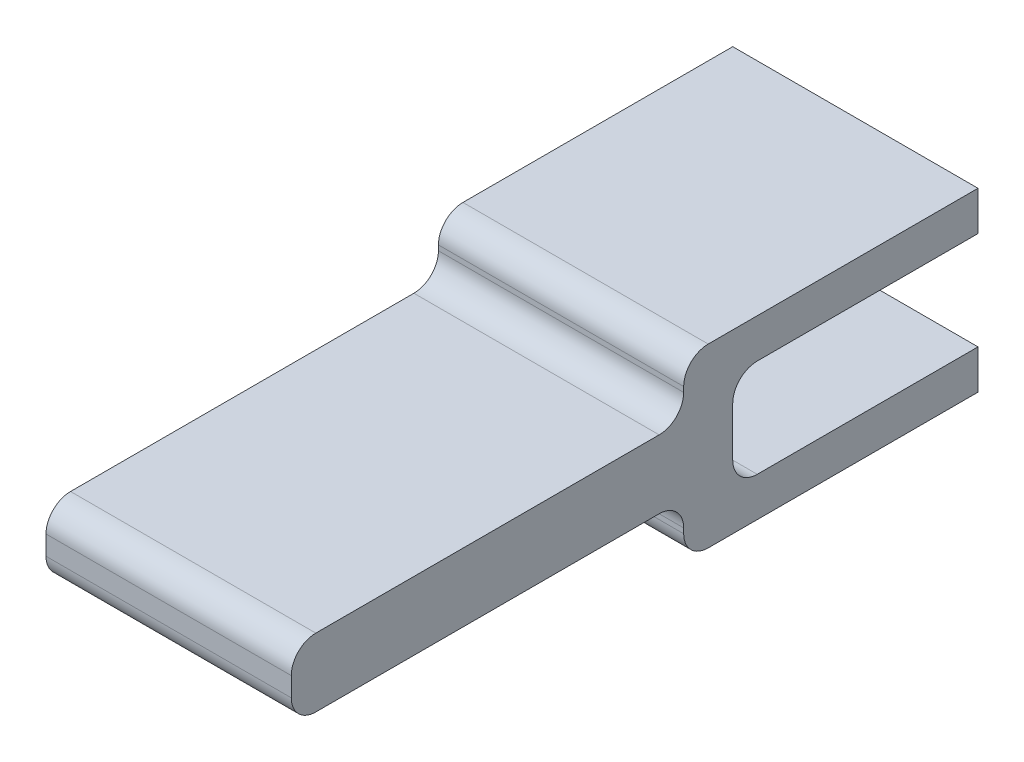
ISO-10303-21;
HEADER;
FILE_DESCRIPTION(('STEP AP214'),'2;1');
FILE_NAME('part.step','',(''),(''),'','','');
FILE_SCHEMA(('AUTOMOTIVE_DESIGN { 1 0 10303 214 1 1 1 1 }'));
ENDSEC;
DATA;
#1=APPLICATION_CONTEXT('core data for automotive mechanical design processes');
#2=APPLICATION_PROTOCOL_DEFINITION('international standard','automotive_design',2000,#1);
#3=PRODUCT_CONTEXT('',#1,'mechanical');
#4=PRODUCT('Part','Part','',(#3));
#5=PRODUCT_RELATED_PRODUCT_CATEGORY('part','',(#4));
#6=PRODUCT_DEFINITION_FORMATION('','',#4);
#7=PRODUCT_DEFINITION_CONTEXT('part definition',#1,'design');
#8=PRODUCT_DEFINITION('design','',#6,#7);
#9=PRODUCT_DEFINITION_SHAPE('','',#8);
#10=(LENGTH_UNIT() NAMED_UNIT(*) SI_UNIT(.MILLI.,.METRE.));
#11=(NAMED_UNIT(*) PLANE_ANGLE_UNIT() SI_UNIT($,.RADIAN.));
#12=(NAMED_UNIT(*) SI_UNIT($,.STERADIAN.) SOLID_ANGLE_UNIT());
#13=UNCERTAINTY_MEASURE_WITH_UNIT(LENGTH_MEASURE(1.E-05),#10,'distance_accuracy_value','');
#14=(GEOMETRIC_REPRESENTATION_CONTEXT(3) GLOBAL_UNCERTAINTY_ASSIGNED_CONTEXT((#13)) GLOBAL_UNIT_ASSIGNED_CONTEXT((#10,
#11,#12)) REPRESENTATION_CONTEXT('',''));
#15=CARTESIAN_POINT('',(0.,0.,0.));
#16=DIRECTION('',(0.,0.,1.));
#17=DIRECTION('',(1.,0.,0.));
#18=AXIS2_PLACEMENT_3D('',#15,#16,#17);
#19=CARTESIAN_POINT('',(0.,0.,6.));
#20=DIRECTION('',(0.,0.,1.));
#21=DIRECTION('',(1.,0.,0.));
#22=AXIS2_PLACEMENT_3D('',#19,#20,#21);
#23=PLANE('',#22);
#24=DIRECTION('',(0.,-1.,0.));
#25=VECTOR('',#24,1.);
#26=CARTESIAN_POINT('',(-2.5,1.8,6.));
#27=LINE('',#26,#25);
#28=CARTESIAN_POINT('',(-2.5,-1.1965181035401,6.));
#29=VERTEX_POINT('',#28);
#30=CARTESIAN_POINT('',(-2.5,-1.3,6.));
#31=VERTEX_POINT('',#30);
#32=EDGE_CURVE('E235',#29,#31,#27,.T.);
#33=ORIENTED_EDGE('',*,*,#32,.T.);
#34=DIRECTION('',(1.,0.,0.));
#35=VECTOR('',#34,1.);
#36=CARTESIAN_POINT('',(2.5,-1.3,6.));
#37=LINE('',#36,#35);
#38=CARTESIAN_POINT('',(2.5,-1.3,6.));
#39=VERTEX_POINT('',#38);
#40=EDGE_CURVE('E295',#31,#39,#37,.T.);
#41=ORIENTED_EDGE('',*,*,#40,.T.);
#42=DIRECTION('',(0.,1.,0.));
#43=VECTOR('',#42,1.);
#44=CARTESIAN_POINT('',(2.5,1.8,6.));
#45=LINE('',#44,#43);
#46=CARTESIAN_POINT('',(2.5,-1.1965181035401,6.));
#47=VERTEX_POINT('',#46);
#48=EDGE_CURVE('E236',#39,#47,#45,.T.);
#49=ORIENTED_EDGE('',*,*,#48,.T.);
#50=DIRECTION('',(1.,0.,0.));
#51=VECTOR('',#50,1.);
#52=CARTESIAN_POINT('',(0.,-1.1965181035401,6.));
#53=LINE('',#52,#51);
#54=EDGE_CURVE('E293',#47,#29,#53,.F.);
#55=ORIENTED_EDGE('',*,*,#54,.T.);
#56=EDGE_LOOP('',(#33,#41,#49,#55));
#57=FACE_BOUND('',#56,.T.);
#58=ADVANCED_FACE('F57',(#57),#23,.T.);
#59=CARTESIAN_POINT('',(0.,0.,0.));
#60=DIRECTION('',(0.,0.,1.));
#61=DIRECTION('',(1.,0.,0.));
#62=AXIS2_PLACEMENT_3D('',#59,#60,#61);
#63=PLANE('',#62);
#64=DIRECTION('',(-1.,0.,0.));
#65=VECTOR('',#64,1.);
#66=CARTESIAN_POINT('',(-2.5,1.,0.));
#67=LINE('',#66,#65);
#68=CARTESIAN_POINT('',(2.5,1.,0.));
#69=VERTEX_POINT('',#68);
#70=CARTESIAN_POINT('',(-2.5,1.,0.));
#71=VERTEX_POINT('',#70);
#72=EDGE_CURVE('E204',#69,#71,#67,.T.);
#73=ORIENTED_EDGE('',*,*,#72,.T.);
#74=DIRECTION('',(0.,-1.,0.));
#75=VECTOR('',#74,1.);
#76=CARTESIAN_POINT('',(-2.5,1.8,0.));
#77=LINE('',#76,#75);
#78=CARTESIAN_POINT('',(-2.5,1.8,0.));
#79=VERTEX_POINT('',#78);
#80=EDGE_CURVE('E255',#79,#71,#77,.T.);
#81=ORIENTED_EDGE('',*,*,#80,.F.);
#82=DIRECTION('',(-1.,0.,0.));
#83=VECTOR('',#82,1.);
#84=CARTESIAN_POINT('',(-2.5,1.8,0.));
#85=LINE('',#84,#83);
#86=CARTESIAN_POINT('',(2.5,1.8,0.));
#87=VERTEX_POINT('',#86);
#88=EDGE_CURVE('E241',#87,#79,#85,.T.);
#89=ORIENTED_EDGE('',*,*,#88,.F.);
#90=DIRECTION('',(0.,1.,0.));
#91=VECTOR('',#90,1.);
#92=CARTESIAN_POINT('',(2.5,1.8,0.));
#93=LINE('',#92,#91);
#94=EDGE_CURVE('E247',#69,#87,#93,.T.);
#95=ORIENTED_EDGE('',*,*,#94,.F.);
#96=EDGE_LOOP('',(#73,#81,#89,#95));
#97=FACE_BOUND('',#96,.T.);
#98=ADVANCED_FACE('F402',(#97),#63,.F.);
#99=CARTESIAN_POINT('',(-2.5,1.8,5.));
#100=DIRECTION('',(0.,-1.,0.));
#101=DIRECTION('',(0.,0.,-1.));
#102=AXIS2_PLACEMENT_3D('',#99,#100,#101);
#103=PLANE('',#102);
#104=DIRECTION('',(0.,0.,1.));
#105=VECTOR('',#104,1.);
#106=CARTESIAN_POINT('',(-2.5,1.8,-0.00100000000000013));
#107=LINE('',#106,#105);
#108=CARTESIAN_POINT('',(-2.5,1.8,5.5));
#109=VERTEX_POINT('',#108);
#110=EDGE_CURVE('E244',#79,#109,#107,.T.);
#111=ORIENTED_EDGE('',*,*,#110,.T.);
#112=DIRECTION('',(-1.,0.,0.));
#113=VECTOR('',#112,1.);
#114=CARTESIAN_POINT('',(2.5,1.8,5.5));
#115=LINE('',#114,#113);
#116=CARTESIAN_POINT('',(2.5,1.8,5.5));
#117=VERTEX_POINT('',#116);
#118=EDGE_CURVE('E304',#109,#117,#115,.F.);
#119=ORIENTED_EDGE('',*,*,#118,.T.);
#120=DIRECTION('',(0.,0.,1.));
#121=VECTOR('',#120,1.);
#122=CARTESIAN_POINT('',(2.5,1.8,-0.00100000000000013));
#123=LINE('',#122,#121);
#124=EDGE_CURVE('E252',#87,#117,#123,.T.);
#125=ORIENTED_EDGE('',*,*,#124,.F.);
#126=ORIENTED_EDGE('',*,*,#88,.T.);
#127=EDGE_LOOP('',(#111,#119,#125,#126));
#128=FACE_BOUND('',#127,.T.);
#129=ADVANCED_FACE('F407',(#128),#103,.F.);
#130=CARTESIAN_POINT('',(-2.5,1.,5.));
#131=DIRECTION('',(0.,-1.,0.));
#132=DIRECTION('',(0.,0.,-1.));
#133=AXIS2_PLACEMENT_3D('',#130,#131,#132);
#134=PLANE('',#133);
#135=DIRECTION('',(0.,0.,-1.));
#136=VECTOR('',#135,1.);
#137=CARTESIAN_POINT('',(2.5,1.,5.));
#138=LINE('',#137,#136);
#139=CARTESIAN_POINT('',(2.5,1.,4.5));
#140=VERTEX_POINT('',#139);
#141=EDGE_CURVE('E245',#140,#69,#138,.T.);
#142=ORIENTED_EDGE('',*,*,#141,.F.);
#143=DIRECTION('',(-1.,0.,0.));
#144=VECTOR('',#143,1.);
#145=CARTESIAN_POINT('',(-2.5,1.,4.5));
#146=LINE('',#145,#144);
#147=CARTESIAN_POINT('',(-2.5,1.,4.5));
#148=VERTEX_POINT('',#147);
#149=EDGE_CURVE('E306',#140,#148,#146,.T.);
#150=ORIENTED_EDGE('',*,*,#149,.T.);
#151=DIRECTION('',(0.,0.,-1.));
#152=VECTOR('',#151,1.);
#153=CARTESIAN_POINT('',(-2.5,1.,5.));
#154=LINE('',#153,#152);
#155=EDGE_CURVE('E248',#148,#71,#154,.T.);
#156=ORIENTED_EDGE('',*,*,#155,.T.);
#157=ORIENTED_EDGE('',*,*,#72,.F.);
#158=EDGE_LOOP('',(#142,#150,#156,#157));
#159=FACE_BOUND('',#158,.T.);
#160=ADVANCED_FACE('F426',(#159),#134,.T.);
#161=CARTESIAN_POINT('',(2.5,1.8,-0.00100000000000013));
#162=DIRECTION('',(-1.,0.,0.));
#163=DIRECTION('',(0.,0.,1.));
#164=AXIS2_PLACEMENT_3D('',#161,#162,#163);
#165=PLANE('',#164);
#166=DIRECTION('',(0.,0.,-1.));
#167=VECTOR('',#166,1.);
#168=CARTESIAN_POINT('',(2.5,0.6965181035401,14.));
#169=LINE('',#168,#167);
#170=CARTESIAN_POINT('',(2.5,0.6965181035401,13.5));
#171=VERTEX_POINT('',#170);
#172=CARTESIAN_POINT('',(2.5,0.6965181035401,6.5));
#173=VERTEX_POINT('',#172);
#174=EDGE_CURVE('E341',#171,#173,#169,.T.);
#175=ORIENTED_EDGE('',*,*,#174,.F.);
#176=CARTESIAN_POINT('',(2.5,0.1965181035401,13.5));
#177=DIRECTION('',(-1.,0.,0.));
#178=DIRECTION('',(0.,0.,1.));
#179=AXIS2_PLACEMENT_3D('',#176,#177,#178);
#180=CIRCLE('',#179,0.5);
#181=CARTESIAN_POINT('',(2.5,0.1965181035401,14.));
#182=VERTEX_POINT('',#181);
#183=EDGE_CURVE('E286',#171,#182,#180,.F.);
#184=ORIENTED_EDGE('',*,*,#183,.T.);
#185=DIRECTION('',(0.,1.,0.));
#186=VECTOR('',#185,1.);
#187=CARTESIAN_POINT('',(2.5,0.6965181035401,14.));
#188=LINE('',#187,#186);
#189=CARTESIAN_POINT('',(2.5,-0.1965181035401,14.));
#190=VERTEX_POINT('',#189);
#191=EDGE_CURVE('E381',#190,#182,#188,.T.);
#192=ORIENTED_EDGE('',*,*,#191,.F.);
#193=CARTESIAN_POINT('',(2.5,-0.1965181035401,13.5));
#194=DIRECTION('',(-1.,0.,0.));
#195=DIRECTION('',(0.,0.,1.));
#196=AXIS2_PLACEMENT_3D('',#193,#194,#195);
#197=CIRCLE('',#196,0.5);
#198=CARTESIAN_POINT('',(2.5,-0.6965181035401,13.5));
#199=VERTEX_POINT('',#198);
#200=EDGE_CURVE('E284',#190,#199,#197,.F.);
#201=ORIENTED_EDGE('',*,*,#200,.T.);
#202=DIRECTION('',(0.,0.,-1.));
#203=VECTOR('',#202,1.);
#204=CARTESIAN_POINT('',(2.5,-0.6965181035401,14.));
#205=LINE('',#204,#203);
#206=CARTESIAN_POINT('',(2.5,-0.6965181035401,6.5));
#207=VERTEX_POINT('',#206);
#208=EDGE_CURVE('E375',#199,#207,#205,.T.);
#209=ORIENTED_EDGE('',*,*,#208,.T.);
#210=CARTESIAN_POINT('',(2.5,-1.1965181035401,6.5));
#211=DIRECTION('',(-1.,0.,0.));
#212=DIRECTION('',(0.,0.,1.));
#213=AXIS2_PLACEMENT_3D('',#210,#211,#212);
#214=CIRCLE('',#213,0.5);
#215=EDGE_CURVE('E322',#207,#47,#214,.T.);
#216=ORIENTED_EDGE('',*,*,#215,.T.);
#217=ORIENTED_EDGE('',*,*,#48,.F.);
#218=CARTESIAN_POINT('',(2.5,-1.3,5.5));
#219=DIRECTION('',(-1.,0.,0.));
#220=DIRECTION('',(0.,0.,1.));
#221=AXIS2_PLACEMENT_3D('',#218,#219,#220);
#222=CIRCLE('',#221,0.5);
#223=CARTESIAN_POINT('',(2.5,-1.8,5.5));
#224=VERTEX_POINT('',#223);
#225=EDGE_CURVE('E282',#39,#224,#222,.F.);
#226=ORIENTED_EDGE('',*,*,#225,.T.);
#227=DIRECTION('',(0.,0.,-1.));
#228=VECTOR('',#227,1.);
#229=CARTESIAN_POINT('',(2.5,-1.8,6.));
#230=LINE('',#229,#228);
#231=CARTESIAN_POINT('',(2.5,-1.8,0.));
#232=VERTEX_POINT('',#231);
#233=EDGE_CURVE('E205',#224,#232,#230,.T.);
#234=ORIENTED_EDGE('',*,*,#233,.T.);
#235=DIRECTION('',(0.,1.,0.));
#236=VECTOR('',#235,1.);
#237=CARTESIAN_POINT('',(2.5,1.8,0.));
#238=LINE('',#237,#236);
#239=CARTESIAN_POINT('',(2.5,-1.,0.));
#240=VERTEX_POINT('',#239);
#241=EDGE_CURVE('E217',#232,#240,#238,.T.);
#242=ORIENTED_EDGE('',*,*,#241,.T.);
#243=DIRECTION('',(0.,0.,-1.));
#244=VECTOR('',#243,1.);
#245=CARTESIAN_POINT('',(2.5,-1.,5.));
#246=LINE('',#245,#244);
#247=CARTESIAN_POINT('',(2.5,-1.,4.5));
#248=VERTEX_POINT('',#247);
#249=EDGE_CURVE('E227',#248,#240,#246,.T.);
#250=ORIENTED_EDGE('',*,*,#249,.F.);
#251=CARTESIAN_POINT('',(2.5,-0.5,4.5));
#252=DIRECTION('',(-1.,0.,0.));
#253=DIRECTION('',(0.,0.,1.));
#254=AXIS2_PLACEMENT_3D('',#251,#252,#253);
#255=CIRCLE('',#254,0.5);
#256=CARTESIAN_POINT('',(2.5,-0.5,5.));
#257=VERTEX_POINT('',#256);
#258=EDGE_CURVE('E79',#248,#257,#255,.T.);
#259=ORIENTED_EDGE('',*,*,#258,.T.);
#260=DIRECTION('',(0.,1.,0.));
#261=VECTOR('',#260,1.);
#262=CARTESIAN_POINT('',(2.5,1.8,5.));
#263=LINE('',#262,#261);
#264=CARTESIAN_POINT('',(2.5,0.5,5.));
#265=VERTEX_POINT('',#264);
#266=EDGE_CURVE('E225',#257,#265,#263,.T.);
#267=ORIENTED_EDGE('',*,*,#266,.T.);
#268=CARTESIAN_POINT('',(2.5,0.5,4.5));
#269=DIRECTION('',(-1.,0.,0.));
#270=DIRECTION('',(0.,0.,1.));
#271=AXIS2_PLACEMENT_3D('',#268,#269,#270);
#272=CIRCLE('',#271,0.5);
#273=EDGE_CURVE('E317',#265,#140,#272,.T.);
#274=ORIENTED_EDGE('',*,*,#273,.T.);
#275=ORIENTED_EDGE('',*,*,#141,.T.);
#276=ORIENTED_EDGE('',*,*,#94,.T.);
#277=ORIENTED_EDGE('',*,*,#124,.T.);
#278=CARTESIAN_POINT('',(2.5,1.3,5.5));
#279=DIRECTION('',(-1.,0.,0.));
#280=DIRECTION('',(0.,0.,1.));
#281=AXIS2_PLACEMENT_3D('',#278,#279,#280);
#282=CIRCLE('',#281,0.5);
#283=CARTESIAN_POINT('',(2.5,1.3,6.));
#284=VERTEX_POINT('',#283);
#285=EDGE_CURVE('E280',#117,#284,#282,.F.);
#286=ORIENTED_EDGE('',*,*,#285,.T.);
#287=CARTESIAN_POINT('',(2.5,1.1965181035401,6.));
#288=VERTEX_POINT('',#287);
#289=EDGE_CURVE('E234',#288,#284,#45,.T.);
#290=ORIENTED_EDGE('',*,*,#289,.F.);
#291=CARTESIAN_POINT('',(2.5,1.1965181035401,6.5));
#292=DIRECTION('',(-1.,0.,0.));
#293=DIRECTION('',(0.,0.,1.));
#294=AXIS2_PLACEMENT_3D('',#291,#292,#293);
#295=CIRCLE('',#294,0.5);
#296=EDGE_CURVE('E12',#288,#173,#295,.T.);
#297=ORIENTED_EDGE('',*,*,#296,.T.);
#298=EDGE_LOOP('',(#175,#184,#192,#201,#209,#216,#217,#226,#234,#242,#250,#259,#267,#274,#275,
#276,#277,#286,#290,#297));
#299=FACE_BOUND('',#298,.T.);
#300=ADVANCED_FACE('F340',(#299),#165,.F.);
#301=CARTESIAN_POINT('',(-2.5,1.8,-0.00100000000000013));
#302=DIRECTION('',(1.,0.,0.));
#303=DIRECTION('',(0.,0.,-1.));
#304=AXIS2_PLACEMENT_3D('',#301,#302,#303);
#305=PLANE('',#304);
#306=DIRECTION('',(0.,-1.,0.));
#307=VECTOR('',#306,1.);
#308=CARTESIAN_POINT('',(-2.5,0.6965181035401,14.));
#309=LINE('',#308,#307);
#310=CARTESIAN_POINT('',(-2.5,0.1965181035401,14.));
#311=VERTEX_POINT('',#310);
#312=CARTESIAN_POINT('',(-2.5,-0.1965181035401,14.));
#313=VERTEX_POINT('',#312);
#314=EDGE_CURVE('E376',#311,#313,#309,.T.);
#315=ORIENTED_EDGE('',*,*,#314,.F.);
#316=CARTESIAN_POINT('',(-2.5,0.1965181035401,13.5));
#317=DIRECTION('',(1.,0.,0.));
#318=DIRECTION('',(0.,0.,-1.));
#319=AXIS2_PLACEMENT_3D('',#316,#317,#318);
#320=CIRCLE('',#319,0.5);
#321=CARTESIAN_POINT('',(-2.5,0.6965181035401,13.5));
#322=VERTEX_POINT('',#321);
#323=EDGE_CURVE('E273',#311,#322,#320,.F.);
#324=ORIENTED_EDGE('',*,*,#323,.T.);
#325=DIRECTION('',(0.,0.,-1.));
#326=VECTOR('',#325,1.);
#327=CARTESIAN_POINT('',(-2.5,0.6965181035401,14.));
#328=LINE('',#327,#326);
#329=CARTESIAN_POINT('',(-2.5,0.6965181035401,6.5));
#330=VERTEX_POINT('',#329);
#331=EDGE_CURVE('E328',#322,#330,#328,.T.);
#332=ORIENTED_EDGE('',*,*,#331,.T.);
#333=CARTESIAN_POINT('',(-2.5,1.1965181035401,6.5));
#334=DIRECTION('',(1.,0.,0.));
#335=DIRECTION('',(0.,0.,-1.));
#336=AXIS2_PLACEMENT_3D('',#333,#334,#335);
#337=CIRCLE('',#336,0.5);
#338=CARTESIAN_POINT('',(-2.5,1.1965181035401,6.));
#339=VERTEX_POINT('',#338);
#340=EDGE_CURVE('E65',#330,#339,#337,.T.);
#341=ORIENTED_EDGE('',*,*,#340,.T.);
#342=CARTESIAN_POINT('',(-2.5,1.3,6.));
#343=VERTEX_POINT('',#342);
#344=EDGE_CURVE('E231',#343,#339,#27,.T.);
#345=ORIENTED_EDGE('',*,*,#344,.F.);
#346=CARTESIAN_POINT('',(-2.5,1.3,5.5));
#347=DIRECTION('',(1.,0.,0.));
#348=DIRECTION('',(0.,0.,-1.));
#349=AXIS2_PLACEMENT_3D('',#346,#347,#348);
#350=CIRCLE('',#349,0.5);
#351=EDGE_CURVE('E267',#343,#109,#350,.F.);
#352=ORIENTED_EDGE('',*,*,#351,.T.);
#353=ORIENTED_EDGE('',*,*,#110,.F.);
#354=ORIENTED_EDGE('',*,*,#80,.T.);
#355=ORIENTED_EDGE('',*,*,#155,.F.);
#356=CARTESIAN_POINT('',(-2.5,0.5,4.5));
#357=DIRECTION('',(1.,0.,0.));
#358=DIRECTION('',(0.,0.,-1.));
#359=AXIS2_PLACEMENT_3D('',#356,#357,#358);
#360=CIRCLE('',#359,0.5);
#361=CARTESIAN_POINT('',(-2.5,0.5,5.));
#362=VERTEX_POINT('',#361);
#363=EDGE_CURVE('E315',#148,#362,#360,.T.);
#364=ORIENTED_EDGE('',*,*,#363,.T.);
#365=DIRECTION('',(0.,-1.,0.));
#366=VECTOR('',#365,1.);
#367=CARTESIAN_POINT('',(-2.5,1.8,5.));
#368=LINE('',#367,#366);
#369=CARTESIAN_POINT('',(-2.5,-0.5,5.));
#370=VERTEX_POINT('',#369);
#371=EDGE_CURVE('E222',#362,#370,#368,.T.);
#372=ORIENTED_EDGE('',*,*,#371,.T.);
#373=CARTESIAN_POINT('',(-2.5,-0.5,4.5));
#374=DIRECTION('',(1.,0.,0.));
#375=DIRECTION('',(0.,0.,-1.));
#376=AXIS2_PLACEMENT_3D('',#373,#374,#375);
#377=CIRCLE('',#376,0.5);
#378=CARTESIAN_POINT('',(-2.5,-1.,4.5));
#379=VERTEX_POINT('',#378);
#380=EDGE_CURVE('E320',#370,#379,#377,.T.);
#381=ORIENTED_EDGE('',*,*,#380,.T.);
#382=DIRECTION('',(0.,0.,-1.));
#383=VECTOR('',#382,1.);
#384=CARTESIAN_POINT('',(-2.5,-1.,5.));
#385=LINE('',#384,#383);
#386=CARTESIAN_POINT('',(-2.5,-1.,0.));
#387=VERTEX_POINT('',#386);
#388=EDGE_CURVE('E212',#379,#387,#385,.T.);
#389=ORIENTED_EDGE('',*,*,#388,.T.);
#390=DIRECTION('',(0.,-1.,0.));
#391=VECTOR('',#390,1.);
#392=CARTESIAN_POINT('',(-2.5,1.8,0.));
#393=LINE('',#392,#391);
#394=CARTESIAN_POINT('',(-2.5,-1.8,0.));
#395=VERTEX_POINT('',#394);
#396=EDGE_CURVE('E208',#387,#395,#393,.T.);
#397=ORIENTED_EDGE('',*,*,#396,.T.);
#398=DIRECTION('',(0.,0.,-1.));
#399=VECTOR('',#398,1.);
#400=CARTESIAN_POINT('',(-2.5,-1.8,6.));
#401=LINE('',#400,#399);
#402=CARTESIAN_POINT('',(-2.5,-1.8,5.5));
#403=VERTEX_POINT('',#402);
#404=EDGE_CURVE('E194',#403,#395,#401,.T.);
#405=ORIENTED_EDGE('',*,*,#404,.F.);
#406=CARTESIAN_POINT('',(-2.5,-1.3,5.5));
#407=DIRECTION('',(1.,0.,0.));
#408=DIRECTION('',(0.,0.,-1.));
#409=AXIS2_PLACEMENT_3D('',#406,#407,#408);
#410=CIRCLE('',#409,0.5);
#411=EDGE_CURVE('E269',#403,#31,#410,.F.);
#412=ORIENTED_EDGE('',*,*,#411,.T.);
#413=ORIENTED_EDGE('',*,*,#32,.F.);
#414=CARTESIAN_POINT('',(-2.5,-1.1965181035401,6.5));
#415=DIRECTION('',(1.,0.,0.));
#416=DIRECTION('',(0.,0.,-1.));
#417=AXIS2_PLACEMENT_3D('',#414,#415,#416);
#418=CIRCLE('',#417,0.5);
#419=CARTESIAN_POINT('',(-2.5,-0.6965181035401,6.5));
#420=VERTEX_POINT('',#419);
#421=EDGE_CURVE('E324',#29,#420,#418,.T.);
#422=ORIENTED_EDGE('',*,*,#421,.T.);
#423=DIRECTION('',(0.,0.,-1.));
#424=VECTOR('',#423,1.);
#425=CARTESIAN_POINT('',(-2.5,-0.6965181035401,14.));
#426=LINE('',#425,#424);
#427=CARTESIAN_POINT('',(-2.5,-0.6965181035401,13.5));
#428=VERTEX_POINT('',#427);
#429=EDGE_CURVE('E348',#428,#420,#426,.T.);
#430=ORIENTED_EDGE('',*,*,#429,.F.);
#431=CARTESIAN_POINT('',(-2.5,-0.1965181035401,13.5));
#432=DIRECTION('',(1.,0.,0.));
#433=DIRECTION('',(0.,0.,-1.));
#434=AXIS2_PLACEMENT_3D('',#431,#432,#433);
#435=CIRCLE('',#434,0.5);
#436=EDGE_CURVE('E271',#428,#313,#435,.F.);
#437=ORIENTED_EDGE('',*,*,#436,.T.);
#438=EDGE_LOOP('',(#315,#324,#332,#341,#345,#352,#353,#354,#355,#364,#372,#381,#389,#397,#405,
#412,#413,#422,#430,#437));
#439=FACE_BOUND('',#438,.T.);
#440=ADVANCED_FACE('F210',(#439),#305,.F.);
#441=CARTESIAN_POINT('',(-2.5,-1.8,6.));
#442=DIRECTION('',(0.,1.,0.));
#443=DIRECTION('',(0.,0.,1.));
#444=AXIS2_PLACEMENT_3D('',#441,#442,#443);
#445=PLANE('',#444);
#446=ORIENTED_EDGE('',*,*,#233,.F.);
#447=DIRECTION('',(1.,0.,0.));
#448=VECTOR('',#447,1.);
#449=CARTESIAN_POINT('',(-2.5,-1.8,5.5));
#450=LINE('',#449,#448);
#451=EDGE_CURVE('E201',#224,#403,#450,.F.);
#452=ORIENTED_EDGE('',*,*,#451,.T.);
#453=ORIENTED_EDGE('',*,*,#404,.T.);
#454=DIRECTION('',(1.,0.,0.));
#455=VECTOR('',#454,1.);
#456=CARTESIAN_POINT('',(-2.5,-1.8,0.));
#457=LINE('',#456,#455);
#458=EDGE_CURVE('E199',#395,#232,#457,.T.);
#459=ORIENTED_EDGE('',*,*,#458,.T.);
#460=EDGE_LOOP('',(#446,#452,#453,#459));
#461=FACE_BOUND('',#460,.T.);
#462=ADVANCED_FACE('F197',(#461),#445,.F.);
#463=ORIENTED_EDGE('',*,*,#289,.T.);
#464=DIRECTION('',(-1.,0.,0.));
#465=VECTOR('',#464,1.);
#466=CARTESIAN_POINT('',(-2.5,1.3,6.));
#467=LINE('',#466,#465);
#468=EDGE_CURVE('E301',#284,#343,#467,.T.);
#469=ORIENTED_EDGE('',*,*,#468,.T.);
#470=ORIENTED_EDGE('',*,*,#344,.T.);
#471=DIRECTION('',(-1.,0.,0.));
#472=VECTOR('',#471,1.);
#473=CARTESIAN_POINT('',(0.,1.1965181035401,6.));
#474=LINE('',#473,#472);
#475=EDGE_CURVE('E299',#339,#288,#474,.F.);
#476=ORIENTED_EDGE('',*,*,#475,.T.);
#477=EDGE_LOOP('',(#463,#469,#470,#476));
#478=FACE_BOUND('',#477,.T.);
#479=ADVANCED_FACE('F334',(#478),#23,.T.);
#480=CARTESIAN_POINT('',(0.,0.,5.));
#481=DIRECTION('',(0.,0.,1.));
#482=DIRECTION('',(1.,0.,0.));
#483=AXIS2_PLACEMENT_3D('',#480,#481,#482);
#484=PLANE('',#483);
#485=ORIENTED_EDGE('',*,*,#371,.F.);
#486=DIRECTION('',(-1.,0.,0.));
#487=VECTOR('',#486,1.);
#488=CARTESIAN_POINT('',(0.,0.5,5.));
#489=LINE('',#488,#487);
#490=EDGE_CURVE('E72',#362,#265,#489,.F.);
#491=ORIENTED_EDGE('',*,*,#490,.T.);
#492=ORIENTED_EDGE('',*,*,#266,.F.);
#493=DIRECTION('',(1.,0.,0.));
#494=VECTOR('',#493,1.);
#495=CARTESIAN_POINT('',(0.,-0.5,5.));
#496=LINE('',#495,#494);
#497=EDGE_CURVE('E309',#257,#370,#496,.F.);
#498=ORIENTED_EDGE('',*,*,#497,.T.);
#499=EDGE_LOOP('',(#485,#491,#492,#498));
#500=FACE_BOUND('',#499,.T.);
#501=ADVANCED_FACE('F413',(#500),#484,.F.);
#502=CARTESIAN_POINT('',(-2.5,-1.,5.));
#503=DIRECTION('',(0.,1.,0.));
#504=DIRECTION('',(0.,0.,1.));
#505=AXIS2_PLACEMENT_3D('',#502,#503,#504);
#506=PLANE('',#505);
#507=ORIENTED_EDGE('',*,*,#388,.F.);
#508=DIRECTION('',(1.,0.,0.));
#509=VECTOR('',#508,1.);
#510=CARTESIAN_POINT('',(-2.5,-1.,4.5));
#511=LINE('',#510,#509);
#512=EDGE_CURVE('E312',#379,#248,#511,.T.);
#513=ORIENTED_EDGE('',*,*,#512,.T.);
#514=ORIENTED_EDGE('',*,*,#249,.T.);
#515=DIRECTION('',(1.,0.,0.));
#516=VECTOR('',#515,1.);
#517=CARTESIAN_POINT('',(-2.5,-1.,0.));
#518=LINE('',#517,#516);
#519=EDGE_CURVE('E216',#387,#240,#518,.T.);
#520=ORIENTED_EDGE('',*,*,#519,.F.);
#521=EDGE_LOOP('',(#507,#513,#514,#520));
#522=FACE_BOUND('',#521,.T.);
#523=ADVANCED_FACE('F353',(#522),#506,.T.);
#524=CARTESIAN_POINT('',(0.,0.,0.));
#525=DIRECTION('',(0.,0.,1.));
#526=DIRECTION('',(1.,0.,0.));
#527=AXIS2_PLACEMENT_3D('',#524,#525,#526);
#528=PLANE('',#527);
#529=ORIENTED_EDGE('',*,*,#458,.F.);
#530=ORIENTED_EDGE('',*,*,#396,.F.);
#531=ORIENTED_EDGE('',*,*,#519,.T.);
#532=ORIENTED_EDGE('',*,*,#241,.F.);
#533=EDGE_LOOP('',(#529,#530,#531,#532));
#534=FACE_BOUND('',#533,.T.);
#535=ADVANCED_FACE('F220',(#534),#528,.F.);
#536=CARTESIAN_POINT('',(-2.5,0.6965181035401,14.));
#537=DIRECTION('',(0.,-1.,0.));
#538=DIRECTION('',(0.,0.,-1.));
#539=AXIS2_PLACEMENT_3D('',#536,#537,#538);
#540=PLANE('',#539);
#541=ORIENTED_EDGE('',*,*,#331,.F.);
#542=DIRECTION('',(-1.,0.,0.));
#543=VECTOR('',#542,1.);
#544=CARTESIAN_POINT('',(2.5,0.6965181035401,13.5));
#545=LINE('',#544,#543);
#546=EDGE_CURVE('E278',#322,#171,#545,.F.);
#547=ORIENTED_EDGE('',*,*,#546,.T.);
#548=ORIENTED_EDGE('',*,*,#174,.T.);
#549=DIRECTION('',(-1.,0.,0.));
#550=VECTOR('',#549,1.);
#551=CARTESIAN_POINT('',(-2.5,0.6965181035401,6.5));
#552=LINE('',#551,#550);
#553=EDGE_CURVE('E275',#173,#330,#552,.T.);
#554=ORIENTED_EDGE('',*,*,#553,.T.);
#555=EDGE_LOOP('',(#541,#547,#548,#554));
#556=FACE_BOUND('',#555,.T.);
#557=ADVANCED_FACE('F344',(#556),#540,.F.);
#558=CARTESIAN_POINT('',(-2.5,-0.6965181035401,14.));
#559=DIRECTION('',(0.,1.,0.));
#560=DIRECTION('',(0.,0.,1.));
#561=AXIS2_PLACEMENT_3D('',#558,#559,#560);
#562=PLANE('',#561);
#563=ORIENTED_EDGE('',*,*,#208,.F.);
#564=DIRECTION('',(1.,0.,0.));
#565=VECTOR('',#564,1.);
#566=CARTESIAN_POINT('',(-2.5,-0.6965181035401,13.5));
#567=LINE('',#566,#565);
#568=EDGE_CURVE('E291',#199,#428,#567,.F.);
#569=ORIENTED_EDGE('',*,*,#568,.T.);
#570=ORIENTED_EDGE('',*,*,#429,.T.);
#571=DIRECTION('',(1.,0.,0.));
#572=VECTOR('',#571,1.);
#573=CARTESIAN_POINT('',(-2.5,-0.6965181035401,6.5));
#574=LINE('',#573,#572);
#575=EDGE_CURVE('E288',#420,#207,#574,.T.);
#576=ORIENTED_EDGE('',*,*,#575,.T.);
#577=EDGE_LOOP('',(#563,#569,#570,#576));
#578=FACE_BOUND('',#577,.T.);
#579=ADVANCED_FACE('F372',(#578),#562,.F.);
#580=CARTESIAN_POINT('',(0.,0.,14.));
#581=DIRECTION('',(0.,0.,1.));
#582=DIRECTION('',(1.,0.,0.));
#583=AXIS2_PLACEMENT_3D('',#580,#581,#582);
#584=PLANE('',#583);
#585=ORIENTED_EDGE('',*,*,#191,.T.);
#586=DIRECTION('',(-1.,0.,0.));
#587=VECTOR('',#586,1.);
#588=CARTESIAN_POINT('',(-2.5,0.1965181035401,14.));
#589=LINE('',#588,#587);
#590=EDGE_CURVE('E264',#182,#311,#589,.T.);
#591=ORIENTED_EDGE('',*,*,#590,.T.);
#592=ORIENTED_EDGE('',*,*,#314,.T.);
#593=DIRECTION('',(1.,0.,0.));
#594=VECTOR('',#593,1.);
#595=CARTESIAN_POINT('',(2.5,-0.1965181035401,14.));
#596=LINE('',#595,#594);
#597=EDGE_CURVE('E260',#313,#190,#596,.T.);
#598=ORIENTED_EDGE('',*,*,#597,.T.);
#599=EDGE_LOOP('',(#585,#591,#592,#598));
#600=FACE_BOUND('',#599,.T.);
#601=ADVANCED_FACE('F386',(#600),#584,.T.);
#602=CARTESIAN_POINT('',(0.,0.1965181035401,13.5));
#603=DIRECTION('',(1.,0.,0.));
#604=DIRECTION('',(0.,0.,-1.));
#605=AXIS2_PLACEMENT_3D('',#602,#603,#604);
#606=CYLINDRICAL_SURFACE('',#605,0.5);
#607=ORIENTED_EDGE('',*,*,#183,.F.);
#608=ORIENTED_EDGE('',*,*,#546,.F.);
#609=ORIENTED_EDGE('',*,*,#323,.F.);
#610=ORIENTED_EDGE('',*,*,#590,.F.);
#611=EDGE_LOOP('',(#607,#608,#609,#610));
#612=FACE_BOUND('',#611,.T.);
#613=ADVANCED_FACE('F389',(#612),#606,.T.);
#614=CARTESIAN_POINT('',(0.,-0.1965181035401,13.5));
#615=DIRECTION('',(-1.,0.,0.));
#616=DIRECTION('',(0.,0.,1.));
#617=AXIS2_PLACEMENT_3D('',#614,#615,#616);
#618=CYLINDRICAL_SURFACE('',#617,0.5);
#619=ORIENTED_EDGE('',*,*,#436,.F.);
#620=ORIENTED_EDGE('',*,*,#568,.F.);
#621=ORIENTED_EDGE('',*,*,#200,.F.);
#622=ORIENTED_EDGE('',*,*,#597,.F.);
#623=EDGE_LOOP('',(#619,#620,#621,#622));
#624=FACE_BOUND('',#623,.T.);
#625=ADVANCED_FACE('F391',(#624),#618,.T.);
#626=CARTESIAN_POINT('',(0.,-1.3,5.5));
#627=DIRECTION('',(-1.,0.,0.));
#628=DIRECTION('',(0.,0.,1.));
#629=AXIS2_PLACEMENT_3D('',#626,#627,#628);
#630=CYLINDRICAL_SURFACE('',#629,0.5);
#631=ORIENTED_EDGE('',*,*,#411,.F.);
#632=ORIENTED_EDGE('',*,*,#451,.F.);
#633=ORIENTED_EDGE('',*,*,#225,.F.);
#634=ORIENTED_EDGE('',*,*,#40,.F.);
#635=EDGE_LOOP('',(#631,#632,#633,#634));
#636=FACE_BOUND('',#635,.T.);
#637=ADVANCED_FACE('F357',(#636),#630,.T.);
#638=CARTESIAN_POINT('',(0.,1.3,5.5));
#639=DIRECTION('',(1.,0.,0.));
#640=DIRECTION('',(0.,0.,-1.));
#641=AXIS2_PLACEMENT_3D('',#638,#639,#640);
#642=CYLINDRICAL_SURFACE('',#641,0.5);
#643=ORIENTED_EDGE('',*,*,#285,.F.);
#644=ORIENTED_EDGE('',*,*,#118,.F.);
#645=ORIENTED_EDGE('',*,*,#351,.F.);
#646=ORIENTED_EDGE('',*,*,#468,.F.);
#647=EDGE_LOOP('',(#643,#644,#645,#646));
#648=FACE_BOUND('',#647,.T.);
#649=ADVANCED_FACE('F398',(#648),#642,.T.);
#650=CARTESIAN_POINT('',(-2.5,0.5,4.5));
#651=DIRECTION('',(-1.,0.,0.));
#652=DIRECTION('',(0.,0.,1.));
#653=AXIS2_PLACEMENT_3D('',#650,#651,#652);
#654=CYLINDRICAL_SURFACE('',#653,0.5);
#655=ORIENTED_EDGE('',*,*,#273,.F.);
#656=ORIENTED_EDGE('',*,*,#490,.F.);
#657=ORIENTED_EDGE('',*,*,#363,.F.);
#658=ORIENTED_EDGE('',*,*,#149,.F.);
#659=EDGE_LOOP('',(#655,#656,#657,#658));
#660=FACE_BOUND('',#659,.T.);
#661=ADVANCED_FACE('F517',(#660),#654,.F.);
#662=CARTESIAN_POINT('',(-2.5,-0.5,4.5));
#663=DIRECTION('',(1.,0.,0.));
#664=DIRECTION('',(0.,0.,-1.));
#665=AXIS2_PLACEMENT_3D('',#662,#663,#664);
#666=CYLINDRICAL_SURFACE('',#665,0.5);
#667=ORIENTED_EDGE('',*,*,#380,.F.);
#668=ORIENTED_EDGE('',*,*,#497,.F.);
#669=ORIENTED_EDGE('',*,*,#258,.F.);
#670=ORIENTED_EDGE('',*,*,#512,.F.);
#671=EDGE_LOOP('',(#667,#668,#669,#670));
#672=FACE_BOUND('',#671,.T.);
#673=ADVANCED_FACE('F527',(#672),#666,.F.);
#674=CARTESIAN_POINT('',(-2.5,-1.1965181035401,6.5));
#675=DIRECTION('',(1.,0.,0.));
#676=DIRECTION('',(0.,0.,-1.));
#677=AXIS2_PLACEMENT_3D('',#674,#675,#676);
#678=CYLINDRICAL_SURFACE('',#677,0.5);
#679=ORIENTED_EDGE('',*,*,#421,.F.);
#680=ORIENTED_EDGE('',*,*,#54,.F.);
#681=ORIENTED_EDGE('',*,*,#215,.F.);
#682=ORIENTED_EDGE('',*,*,#575,.F.);
#683=EDGE_LOOP('',(#679,#680,#681,#682));
#684=FACE_BOUND('',#683,.T.);
#685=ADVANCED_FACE('F365',(#684),#678,.F.);
#686=CARTESIAN_POINT('',(-2.5,1.1965181035401,6.5));
#687=DIRECTION('',(-1.,0.,0.));
#688=DIRECTION('',(0.,0.,1.));
#689=AXIS2_PLACEMENT_3D('',#686,#687,#688);
#690=CYLINDRICAL_SURFACE('',#689,0.5);
#691=ORIENTED_EDGE('',*,*,#296,.F.);
#692=ORIENTED_EDGE('',*,*,#475,.F.);
#693=ORIENTED_EDGE('',*,*,#340,.F.);
#694=ORIENTED_EDGE('',*,*,#553,.F.);
#695=EDGE_LOOP('',(#691,#692,#693,#694));
#696=FACE_BOUND('',#695,.T.);
#697=ADVANCED_FACE('F59',(#696),#690,.F.);
#698=CLOSED_SHELL('',(#58,#98,#129,#160,#300,#440,#462,#479,#501,#523,#535,#557,#579,#601,#613,
#625,#637,#649,#661,#673,#685,#697));
#699=MANIFOLD_SOLID_BREP('B2',#698);
#700=ADVANCED_BREP_SHAPE_REPRESENTATION('',(#18,#699),#14);
#701=SHAPE_DEFINITION_REPRESENTATION(#9,#700);
ENDSEC;
END-ISO-10303-21;
